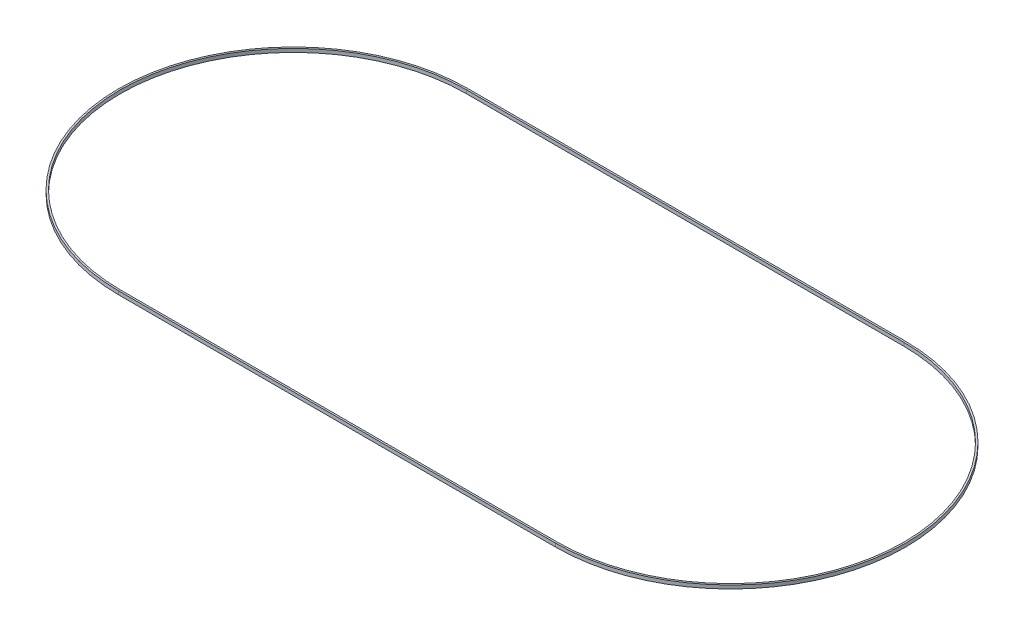
ISO-10303-21;
HEADER;
FILE_DESCRIPTION(('STEP AP214'),'2;1');
FILE_NAME('part.step','',(''),(''),'','','');
FILE_SCHEMA(('AUTOMOTIVE_DESIGN { 1 0 10303 214 1 1 1 1 }'));
ENDSEC;
DATA;
#1=APPLICATION_CONTEXT('core data for automotive mechanical design processes');
#2=APPLICATION_PROTOCOL_DEFINITION('international standard','automotive_design',2000,#1);
#3=PRODUCT_CONTEXT('',#1,'mechanical');
#4=PRODUCT('Part','Part','',(#3));
#5=PRODUCT_RELATED_PRODUCT_CATEGORY('part','',(#4));
#6=PRODUCT_DEFINITION_FORMATION('','',#4);
#7=PRODUCT_DEFINITION_CONTEXT('part definition',#1,'design');
#8=PRODUCT_DEFINITION('design','',#6,#7);
#9=PRODUCT_DEFINITION_SHAPE('','',#8);
#10=(LENGTH_UNIT() NAMED_UNIT(*) SI_UNIT(.MILLI.,.METRE.));
#11=(NAMED_UNIT(*) PLANE_ANGLE_UNIT() SI_UNIT($,.RADIAN.));
#12=(NAMED_UNIT(*) SI_UNIT($,.STERADIAN.) SOLID_ANGLE_UNIT());
#13=UNCERTAINTY_MEASURE_WITH_UNIT(LENGTH_MEASURE(1.E-05),#10,'distance_accuracy_value','');
#14=(GEOMETRIC_REPRESENTATION_CONTEXT(3) GLOBAL_UNCERTAINTY_ASSIGNED_CONTEXT((#13)) GLOBAL_UNIT_ASSIGNED_CONTEXT((#10,
#11,#12)) REPRESENTATION_CONTEXT('',''));
#15=CARTESIAN_POINT('',(0.,0.,0.));
#16=DIRECTION('',(0.,0.,1.));
#17=DIRECTION('',(1.,0.,0.));
#18=AXIS2_PLACEMENT_3D('',#15,#16,#17);
#19=CARTESIAN_POINT('',(25000.,400.,6.63267517939197E-13));
#20=DIRECTION('',(0.,-1.,0.));
#21=DIRECTION('',(0.,0.,-1.));
#22=AXIS2_PLACEMENT_3D('',#19,#20,#21);
#23=CYLINDRICAL_SURFACE('',#22,20000.);
#24=CARTESIAN_POINT('',(25000.,0.,6.63267517939197E-13));
#25=DIRECTION('',(0.,1.,0.));
#26=DIRECTION('',(0.,0.,1.));
#27=AXIS2_PLACEMENT_3D('',#24,#25,#26);
#28=CIRCLE('',#27,20000.);
#29=CARTESIAN_POINT('',(25000.,0.,-20000.));
#30=VERTEX_POINT('',#29);
#31=CARTESIAN_POINT('',(25000.,0.,20000.));
#32=VERTEX_POINT('',#31);
#33=EDGE_CURVE('E146',#30,#32,#28,.F.);
#34=ORIENTED_EDGE('',*,*,#33,.F.);
#35=DIRECTION('',(0.,-1.,0.));
#36=VECTOR('',#35,1.);
#37=CARTESIAN_POINT('',(25000.,400.,-20000.));
#38=LINE('',#37,#36);
#39=CARTESIAN_POINT('',(25000.,400.,-20000.));
#40=VERTEX_POINT('',#39);
#41=EDGE_CURVE('E11',#40,#30,#38,.T.);
#42=ORIENTED_EDGE('',*,*,#41,.F.);
#43=CARTESIAN_POINT('',(25000.,400.,6.63267517939197E-13));
#44=DIRECTION('',(0.,1.,0.));
#45=DIRECTION('',(0.,0.,1.));
#46=AXIS2_PLACEMENT_3D('',#43,#44,#45);
#47=CIRCLE('',#46,20000.);
#48=CARTESIAN_POINT('',(25000.,400.,20000.));
#49=VERTEX_POINT('',#48);
#50=EDGE_CURVE('E127',#40,#49,#47,.F.);
#51=ORIENTED_EDGE('',*,*,#50,.T.);
#52=DIRECTION('',(0.,-1.,0.));
#53=VECTOR('',#52,1.);
#54=CARTESIAN_POINT('',(25000.,400.,20000.));
#55=LINE('',#54,#53);
#56=EDGE_CURVE('E89',#49,#32,#55,.T.);
#57=ORIENTED_EDGE('',*,*,#56,.T.);
#58=EDGE_LOOP('',(#34,#42,#51,#57));
#59=FACE_BOUND('',#58,.T.);
#60=ADVANCED_FACE('F35',(#59),#23,.T.);
#61=CARTESIAN_POINT('',(0.,400.,-20000.));
#62=DIRECTION('',(0.,0.,-1.));
#63=DIRECTION('',(-1.,0.,0.));
#64=AXIS2_PLACEMENT_3D('',#61,#62,#63);
#65=PLANE('',#64);
#66=DIRECTION('',(1.,0.,0.));
#67=VECTOR('',#66,1.);
#68=CARTESIAN_POINT('',(0.,0.,-20000.));
#69=LINE('',#68,#67);
#70=CARTESIAN_POINT('',(-25000.,0.,-20000.));
#71=VERTEX_POINT('',#70);
#72=EDGE_CURVE('E117',#71,#30,#69,.T.);
#73=ORIENTED_EDGE('',*,*,#72,.F.);
#74=DIRECTION('',(0.,-1.,0.));
#75=VECTOR('',#74,1.);
#76=CARTESIAN_POINT('',(-25000.,400.,-20000.));
#77=LINE('',#76,#75);
#78=CARTESIAN_POINT('',(-25000.,400.,-20000.));
#79=VERTEX_POINT('',#78);
#80=EDGE_CURVE('E45',#79,#71,#77,.T.);
#81=ORIENTED_EDGE('',*,*,#80,.F.);
#82=DIRECTION('',(1.,0.,0.));
#83=VECTOR('',#82,1.);
#84=CARTESIAN_POINT('',(0.,400.,-20000.));
#85=LINE('',#84,#83);
#86=EDGE_CURVE('E115',#79,#40,#85,.T.);
#87=ORIENTED_EDGE('',*,*,#86,.T.);
#88=ORIENTED_EDGE('',*,*,#41,.T.);
#89=EDGE_LOOP('',(#73,#81,#87,#88));
#90=FACE_BOUND('',#89,.T.);
#91=ADVANCED_FACE('F113',(#90),#65,.T.);
#92=CARTESIAN_POINT('',(-25000.,400.,9.84811851154435E-12));
#93=DIRECTION('',(0.,-1.,0.));
#94=DIRECTION('',(0.,0.,-1.));
#95=AXIS2_PLACEMENT_3D('',#92,#93,#94);
#96=CYLINDRICAL_SURFACE('',#95,20000.);
#97=CARTESIAN_POINT('',(-25000.,0.,9.84811851154435E-12));
#98=DIRECTION('',(0.,1.,0.));
#99=DIRECTION('',(0.,0.,1.));
#100=AXIS2_PLACEMENT_3D('',#97,#98,#99);
#101=CIRCLE('',#100,20000.);
#102=CARTESIAN_POINT('',(-25000.,0.,20000.));
#103=VERTEX_POINT('',#102);
#104=EDGE_CURVE('E149',#71,#103,#101,.T.);
#105=ORIENTED_EDGE('',*,*,#104,.T.);
#106=DIRECTION('',(0.,-1.,0.));
#107=VECTOR('',#106,1.);
#108=CARTESIAN_POINT('',(-25000.,400.,20000.));
#109=LINE('',#108,#107);
#110=CARTESIAN_POINT('',(-25000.,400.,20000.));
#111=VERTEX_POINT('',#110);
#112=EDGE_CURVE('E120',#111,#103,#109,.T.);
#113=ORIENTED_EDGE('',*,*,#112,.F.);
#114=CARTESIAN_POINT('',(-25000.,400.,9.84811851154435E-12));
#115=DIRECTION('',(0.,1.,0.));
#116=DIRECTION('',(0.,0.,1.));
#117=AXIS2_PLACEMENT_3D('',#114,#115,#116);
#118=CIRCLE('',#117,20000.);
#119=EDGE_CURVE('E123',#79,#111,#118,.T.);
#120=ORIENTED_EDGE('',*,*,#119,.F.);
#121=ORIENTED_EDGE('',*,*,#80,.T.);
#122=EDGE_LOOP('',(#105,#113,#120,#121));
#123=FACE_BOUND('',#122,.T.);
#124=ADVANCED_FACE('F124',(#123),#96,.T.);
#125=CARTESIAN_POINT('',(-25000.,400.,9.84811851154435E-12));
#126=DIRECTION('',(0.,-1.,0.));
#127=DIRECTION('',(0.,0.,-1.));
#128=AXIS2_PLACEMENT_3D('',#125,#126,#127);
#129=CYLINDRICAL_SURFACE('',#128,19800.);
#130=CARTESIAN_POINT('',(-25000.,0.,9.84811851154435E-12));
#131=DIRECTION('',(0.,1.,0.));
#132=DIRECTION('',(0.,0.,1.));
#133=AXIS2_PLACEMENT_3D('',#130,#131,#132);
#134=CIRCLE('',#133,19800.);
#135=CARTESIAN_POINT('',(-25000.,0.,-19800.));
#136=VERTEX_POINT('',#135);
#137=CARTESIAN_POINT('',(-25000.,0.,19800.));
#138=VERTEX_POINT('',#137);
#139=EDGE_CURVE('E135',#136,#138,#134,.T.);
#140=ORIENTED_EDGE('',*,*,#139,.F.);
#141=DIRECTION('',(0.,-1.,0.));
#142=VECTOR('',#141,1.);
#143=CARTESIAN_POINT('',(-25000.,400.,-19800.));
#144=LINE('',#143,#142);
#145=CARTESIAN_POINT('',(-25000.,400.,-19800.));
#146=VERTEX_POINT('',#145);
#147=EDGE_CURVE('E39',#146,#136,#144,.T.);
#148=ORIENTED_EDGE('',*,*,#147,.F.);
#149=CARTESIAN_POINT('',(-25000.,400.,9.84811851154435E-12));
#150=DIRECTION('',(0.,1.,0.));
#151=DIRECTION('',(0.,0.,1.));
#152=AXIS2_PLACEMENT_3D('',#149,#150,#151);
#153=CIRCLE('',#152,19800.);
#154=CARTESIAN_POINT('',(-25000.,400.,19800.));
#155=VERTEX_POINT('',#154);
#156=EDGE_CURVE('E152',#146,#155,#153,.T.);
#157=ORIENTED_EDGE('',*,*,#156,.T.);
#158=DIRECTION('',(0.,-1.,0.));
#159=VECTOR('',#158,1.);
#160=CARTESIAN_POINT('',(-25000.,400.,19800.));
#161=LINE('',#160,#159);
#162=EDGE_CURVE('E134',#155,#138,#161,.T.);
#163=ORIENTED_EDGE('',*,*,#162,.T.);
#164=EDGE_LOOP('',(#140,#148,#157,#163));
#165=FACE_BOUND('',#164,.T.);
#166=ADVANCED_FACE('F37',(#165),#129,.F.);
#167=CARTESIAN_POINT('',(0.,400.,-19800.));
#168=DIRECTION('',(0.,0.,-1.));
#169=DIRECTION('',(-1.,0.,0.));
#170=AXIS2_PLACEMENT_3D('',#167,#168,#169);
#171=PLANE('',#170);
#172=DIRECTION('',(1.,0.,0.));
#173=VECTOR('',#172,1.);
#174=CARTESIAN_POINT('',(0.,0.,-19800.));
#175=LINE('',#174,#173);
#176=CARTESIAN_POINT('',(25000.,0.,-19800.));
#177=VERTEX_POINT('',#176);
#178=EDGE_CURVE('E138',#136,#177,#175,.T.);
#179=ORIENTED_EDGE('',*,*,#178,.T.);
#180=DIRECTION('',(0.,-1.,0.));
#181=VECTOR('',#180,1.);
#182=CARTESIAN_POINT('',(25000.,400.,-19800.));
#183=LINE('',#182,#181);
#184=CARTESIAN_POINT('',(25000.,400.,-19800.));
#185=VERTEX_POINT('',#184);
#186=EDGE_CURVE('E157',#185,#177,#183,.T.);
#187=ORIENTED_EDGE('',*,*,#186,.F.);
#188=DIRECTION('',(1.,0.,0.));
#189=VECTOR('',#188,1.);
#190=CARTESIAN_POINT('',(0.,400.,-19800.));
#191=LINE('',#190,#189);
#192=EDGE_CURVE('E166',#146,#185,#191,.T.);
#193=ORIENTED_EDGE('',*,*,#192,.F.);
#194=ORIENTED_EDGE('',*,*,#147,.T.);
#195=EDGE_LOOP('',(#179,#187,#193,#194));
#196=FACE_BOUND('',#195,.T.);
#197=ADVANCED_FACE('F165',(#196),#171,.F.);
#198=CARTESIAN_POINT('',(25000.,400.,6.63267517939197E-13));
#199=DIRECTION('',(0.,-1.,0.));
#200=DIRECTION('',(0.,0.,-1.));
#201=AXIS2_PLACEMENT_3D('',#198,#199,#200);
#202=CYLINDRICAL_SURFACE('',#201,19800.);
#203=CARTESIAN_POINT('',(25000.,0.,6.63267517939197E-13));
#204=DIRECTION('',(0.,1.,0.));
#205=DIRECTION('',(0.,0.,1.));
#206=AXIS2_PLACEMENT_3D('',#203,#204,#205);
#207=CIRCLE('',#206,19800.);
#208=CARTESIAN_POINT('',(25000.,0.,19800.));
#209=VERTEX_POINT('',#208);
#210=EDGE_CURVE('E140',#177,#209,#207,.F.);
#211=ORIENTED_EDGE('',*,*,#210,.T.);
#212=DIRECTION('',(0.,-1.,0.));
#213=VECTOR('',#212,1.);
#214=CARTESIAN_POINT('',(25000.,400.,19800.));
#215=LINE('',#214,#213);
#216=CARTESIAN_POINT('',(25000.,400.,19800.));
#217=VERTEX_POINT('',#216);
#218=EDGE_CURVE('E156',#217,#209,#215,.T.);
#219=ORIENTED_EDGE('',*,*,#218,.F.);
#220=CARTESIAN_POINT('',(25000.,400.,6.63267517939197E-13));
#221=DIRECTION('',(0.,1.,0.));
#222=DIRECTION('',(0.,0.,1.));
#223=AXIS2_PLACEMENT_3D('',#220,#221,#222);
#224=CIRCLE('',#223,19800.);
#225=EDGE_CURVE('E204',#185,#217,#224,.F.);
#226=ORIENTED_EDGE('',*,*,#225,.F.);
#227=ORIENTED_EDGE('',*,*,#186,.T.);
#228=EDGE_LOOP('',(#211,#219,#226,#227));
#229=FACE_BOUND('',#228,.T.);
#230=ADVANCED_FACE('F176',(#229),#202,.F.);
#231=CARTESIAN_POINT('',(0.,400.,19800.));
#232=DIRECTION('',(0.,0.,-1.));
#233=DIRECTION('',(-1.,0.,0.));
#234=AXIS2_PLACEMENT_3D('',#231,#232,#233);
#235=PLANE('',#234);
#236=DIRECTION('',(1.,0.,0.));
#237=VECTOR('',#236,1.);
#238=CARTESIAN_POINT('',(0.,0.,19800.));
#239=LINE('',#238,#237);
#240=EDGE_CURVE('E143',#138,#209,#239,.T.);
#241=ORIENTED_EDGE('',*,*,#240,.F.);
#242=ORIENTED_EDGE('',*,*,#162,.F.);
#243=DIRECTION('',(1.,0.,0.));
#244=VECTOR('',#243,1.);
#245=CARTESIAN_POINT('',(0.,400.,19800.));
#246=LINE('',#245,#244);
#247=EDGE_CURVE('E129',#155,#217,#246,.T.);
#248=ORIENTED_EDGE('',*,*,#247,.T.);
#249=ORIENTED_EDGE('',*,*,#218,.T.);
#250=EDGE_LOOP('',(#241,#242,#248,#249));
#251=FACE_BOUND('',#250,.T.);
#252=ADVANCED_FACE('F174',(#251),#235,.T.);
#253=CARTESIAN_POINT('',(0.,400.,20000.));
#254=DIRECTION('',(0.,0.,-1.));
#255=DIRECTION('',(-1.,0.,0.));
#256=AXIS2_PLACEMENT_3D('',#253,#254,#255);
#257=PLANE('',#256);
#258=DIRECTION('',(1.,0.,0.));
#259=VECTOR('',#258,1.);
#260=CARTESIAN_POINT('',(0.,0.,20000.));
#261=LINE('',#260,#259);
#262=EDGE_CURVE('E82',#103,#32,#261,.T.);
#263=ORIENTED_EDGE('',*,*,#262,.T.);
#264=ORIENTED_EDGE('',*,*,#56,.F.);
#265=DIRECTION('',(1.,0.,0.));
#266=VECTOR('',#265,1.);
#267=CARTESIAN_POINT('',(0.,400.,20000.));
#268=LINE('',#267,#266);
#269=EDGE_CURVE('E54',#111,#49,#268,.T.);
#270=ORIENTED_EDGE('',*,*,#269,.F.);
#271=ORIENTED_EDGE('',*,*,#112,.T.);
#272=EDGE_LOOP('',(#263,#264,#270,#271));
#273=FACE_BOUND('',#272,.T.);
#274=ADVANCED_FACE('F183',(#273),#257,.F.);
#275=CARTESIAN_POINT('',(0.,400.,0.));
#276=DIRECTION('',(0.,1.,0.));
#277=DIRECTION('',(0.,0.,1.));
#278=AXIS2_PLACEMENT_3D('',#275,#276,#277);
#279=PLANE('',#278);
#280=ORIENTED_EDGE('',*,*,#156,.F.);
#281=ORIENTED_EDGE('',*,*,#192,.T.);
#282=ORIENTED_EDGE('',*,*,#225,.T.);
#283=ORIENTED_EDGE('',*,*,#247,.F.);
#284=EDGE_LOOP('',(#280,#281,#282,#283));
#285=FACE_BOUND('',#284,.T.);
#286=ORIENTED_EDGE('',*,*,#50,.F.);
#287=ORIENTED_EDGE('',*,*,#86,.F.);
#288=ORIENTED_EDGE('',*,*,#119,.T.);
#289=ORIENTED_EDGE('',*,*,#269,.T.);
#290=EDGE_LOOP('',(#286,#287,#288,#289));
#291=FACE_BOUND('',#290,.T.);
#292=ADVANCED_FACE('F126',(#285,#291),#279,.T.);
#293=CARTESIAN_POINT('',(0.,0.,0.));
#294=DIRECTION('',(0.,1.,0.));
#295=DIRECTION('',(0.,0.,1.));
#296=AXIS2_PLACEMENT_3D('',#293,#294,#295);
#297=PLANE('',#296);
#298=ORIENTED_EDGE('',*,*,#139,.T.);
#299=ORIENTED_EDGE('',*,*,#240,.T.);
#300=ORIENTED_EDGE('',*,*,#210,.F.);
#301=ORIENTED_EDGE('',*,*,#178,.F.);
#302=EDGE_LOOP('',(#298,#299,#300,#301));
#303=FACE_BOUND('',#302,.T.);
#304=ORIENTED_EDGE('',*,*,#33,.T.);
#305=ORIENTED_EDGE('',*,*,#262,.F.);
#306=ORIENTED_EDGE('',*,*,#104,.F.);
#307=ORIENTED_EDGE('',*,*,#72,.T.);
#308=EDGE_LOOP('',(#304,#305,#306,#307));
#309=FACE_BOUND('',#308,.T.);
#310=ADVANCED_FACE('F169',(#303,#309),#297,.F.);
#311=CLOSED_SHELL('',(#60,#91,#124,#166,#197,#230,#252,#274,#292,#310));
#312=MANIFOLD_SOLID_BREP('B2',#311);
#313=ADVANCED_BREP_SHAPE_REPRESENTATION('',(#18,#312),#14);
#314=SHAPE_DEFINITION_REPRESENTATION(#9,#313);
ENDSEC;
END-ISO-10303-21;
